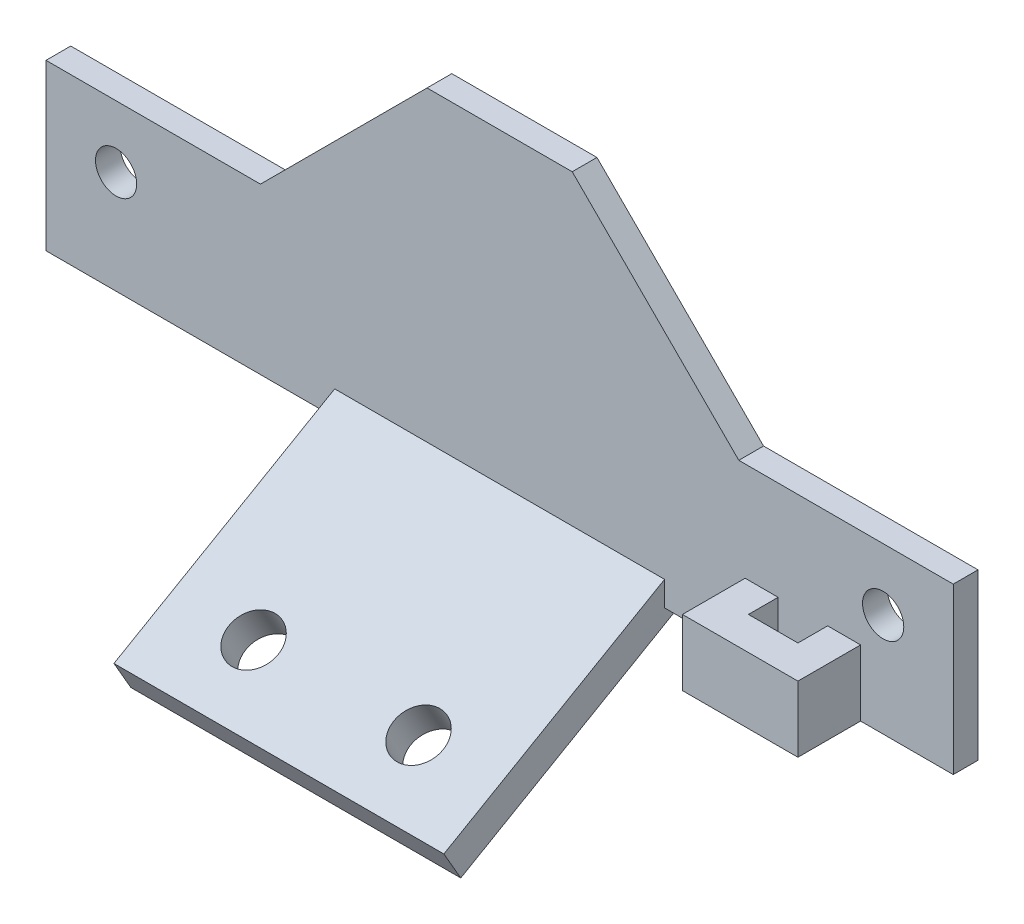
ISO-10303-21;
HEADER;
FILE_DESCRIPTION(('STEP AP214'),'2;1');
FILE_NAME('part.step','',(''),(''),'','','');
FILE_SCHEMA(('AUTOMOTIVE_DESIGN { 1 0 10303 214 1 1 1 1 }'));
ENDSEC;
DATA;
#1=APPLICATION_CONTEXT('core data for automotive mechanical design processes');
#2=APPLICATION_PROTOCOL_DEFINITION('international standard','automotive_design',2000,#1);
#3=PRODUCT_CONTEXT('',#1,'mechanical');
#4=PRODUCT('Part','Part','',(#3));
#5=PRODUCT_RELATED_PRODUCT_CATEGORY('part','',(#4));
#6=PRODUCT_DEFINITION_FORMATION('','',#4);
#7=PRODUCT_DEFINITION_CONTEXT('part definition',#1,'design');
#8=PRODUCT_DEFINITION('design','',#6,#7);
#9=PRODUCT_DEFINITION_SHAPE('','',#8);
#10=(LENGTH_UNIT() NAMED_UNIT(*) SI_UNIT(.MILLI.,.METRE.));
#11=(NAMED_UNIT(*) PLANE_ANGLE_UNIT() SI_UNIT($,.RADIAN.));
#12=(NAMED_UNIT(*) SI_UNIT($,.STERADIAN.) SOLID_ANGLE_UNIT());
#13=UNCERTAINTY_MEASURE_WITH_UNIT(LENGTH_MEASURE(1.E-05),#10,'distance_accuracy_value','');
#14=(GEOMETRIC_REPRESENTATION_CONTEXT(3) GLOBAL_UNCERTAINTY_ASSIGNED_CONTEXT((#13)) GLOBAL_UNIT_ASSIGNED_CONTEXT((#10,
#11,#12)) REPRESENTATION_CONTEXT('',''));
#15=CARTESIAN_POINT('',(0.,0.,0.));
#16=DIRECTION('',(0.,0.,1.));
#17=DIRECTION('',(1.,0.,0.));
#18=AXIS2_PLACEMENT_3D('',#15,#16,#17);
#19=CARTESIAN_POINT('',(0.,0.,1.5));
#20=DIRECTION('',(0.,0.,1.));
#21=DIRECTION('',(1.,0.,0.));
#22=AXIS2_PLACEMENT_3D('',#19,#20,#21);
#23=PLANE('',#22);
#24=DIRECTION('',(0.,-1.,0.));
#25=VECTOR('',#24,1.);
#26=CARTESIAN_POINT('',(-24.4543137079809,8.24999999999999,1.5));
#27=LINE('',#26,#25);
#28=CARTESIAN_POINT('',(-24.4543137079809,8.24999999999999,1.5));
#29=VERTEX_POINT('',#28);
#30=CARTESIAN_POINT('',(-24.4543137079809,4.24999999999999,1.5));
#31=VERTEX_POINT('',#30);
#32=EDGE_CURVE('E237',#29,#31,#27,.T.);
#33=ORIENTED_EDGE('',*,*,#32,.T.);
#34=DIRECTION('',(1.,0.,0.));
#35=VECTOR('',#34,1.);
#36=CARTESIAN_POINT('',(-31.3373101952278,4.24999999999999,1.5));
#37=LINE('',#36,#35);
#38=CARTESIAN_POINT('',(-21.4543137079809,4.24999999999999,1.5));
#39=VERTEX_POINT('',#38);
#40=EDGE_CURVE('E270',#31,#39,#37,.T.);
#41=ORIENTED_EDGE('',*,*,#40,.T.);
#42=DIRECTION('',(0.,-1.,0.));
#43=VECTOR('',#42,1.);
#44=CARTESIAN_POINT('',(-21.4543137079809,8.24999999999999,1.5));
#45=LINE('',#44,#43);
#46=CARTESIAN_POINT('',(-21.4543137079809,8.24999999999999,1.5));
#47=VERTEX_POINT('',#46);
#48=EDGE_CURVE('E230',#47,#39,#45,.T.);
#49=ORIENTED_EDGE('',*,*,#48,.F.);
#50=DIRECTION('',(-1.,0.,0.));
#51=VECTOR('',#50,1.);
#52=CARTESIAN_POINT('',(0.,8.25,1.5));
#53=LINE('',#52,#51);
#54=CARTESIAN_POINT('',(-19.4543137079809,8.24999999999999,1.5));
#55=VERTEX_POINT('',#54);
#56=EDGE_CURVE('E197',#55,#47,#53,.T.);
#57=ORIENTED_EDGE('',*,*,#56,.F.);
#58=DIRECTION('',(0.,-1.,0.));
#59=VECTOR('',#58,1.);
#60=CARTESIAN_POINT('',(-19.4543137079809,8.24999999999999,1.5));
#61=LINE('',#60,#59);
#62=CARTESIAN_POINT('',(-19.4543137079809,4.24999999999999,1.5));
#63=VERTEX_POINT('',#62);
#64=EDGE_CURVE('E201',#55,#63,#61,.T.);
#65=ORIENTED_EDGE('',*,*,#64,.T.);
#66=CARTESIAN_POINT('',(-13.8373101952277,4.24999999999999,1.5));
#67=VERTEX_POINT('',#66);
#68=EDGE_CURVE('E271',#63,#67,#37,.T.);
#69=ORIENTED_EDGE('',*,*,#68,.T.);
#70=DIRECTION('',(0.,1.,0.));
#71=VECTOR('',#70,1.);
#72=CARTESIAN_POINT('',(-13.8373101952278,14.25,1.5));
#73=LINE('',#72,#71);
#74=CARTESIAN_POINT('',(-13.8373101952278,14.25,1.5));
#75=VERTEX_POINT('',#74);
#76=EDGE_CURVE('E312',#67,#75,#73,.T.);
#77=ORIENTED_EDGE('',*,*,#76,.T.);
#78=DIRECTION('',(-1.,0.,0.));
#79=VECTOR('',#78,1.);
#80=CARTESIAN_POINT('',(-13.8373101952278,14.25,1.5));
#81=LINE('',#80,#79);
#82=CARTESIAN_POINT('',(-26.8373101952278,14.25,1.5));
#83=VERTEX_POINT('',#82);
#84=EDGE_CURVE('E315',#75,#83,#81,.T.);
#85=ORIENTED_EDGE('',*,*,#84,.T.);
#86=DIRECTION('',(-0.707106781186557,0.707106781186538,0.));
#87=VECTOR('',#86,1.);
#88=CARTESIAN_POINT('',(-26.8373101952278,14.25,1.5));
#89=LINE('',#88,#87);
#90=CARTESIAN_POINT('',(-36.937310195228,24.35,1.5));
#91=VERTEX_POINT('',#90);
#92=EDGE_CURVE('E317',#83,#91,#89,.T.);
#93=ORIENTED_EDGE('',*,*,#92,.T.);
#94=DIRECTION('',(-1.,0.,0.));
#95=VECTOR('',#94,1.);
#96=CARTESIAN_POINT('',(-36.937310195228,24.35,1.5));
#97=LINE('',#96,#95);
#98=CARTESIAN_POINT('',(-45.7373101952278,24.35,1.5));
#99=VERTEX_POINT('',#98);
#100=EDGE_CURVE('E319',#91,#99,#97,.T.);
#101=ORIENTED_EDGE('',*,*,#100,.T.);
#102=DIRECTION('',(-0.707106781186546,-0.707106781186549,0.));
#103=VECTOR('',#102,1.);
#104=CARTESIAN_POINT('',(-55.8373101952278,14.25,1.5));
#105=LINE('',#104,#103);
#106=CARTESIAN_POINT('',(-55.8373101952278,14.25,1.5));
#107=VERTEX_POINT('',#106);
#108=EDGE_CURVE('E321',#99,#107,#105,.T.);
#109=ORIENTED_EDGE('',*,*,#108,.T.);
#110=DIRECTION('',(-1.,0.,0.));
#111=VECTOR('',#110,1.);
#112=CARTESIAN_POINT('',(-68.8373101952277,14.25,1.5));
#113=LINE('',#112,#111);
#114=CARTESIAN_POINT('',(-68.8373101952277,14.25,1.5));
#115=VERTEX_POINT('',#114);
#116=EDGE_CURVE('E323',#107,#115,#113,.T.);
#117=ORIENTED_EDGE('',*,*,#116,.T.);
#118=DIRECTION('',(0.,-1.,0.));
#119=VECTOR('',#118,1.);
#120=CARTESIAN_POINT('',(-68.8373101952277,14.25,1.5));
#121=LINE('',#120,#119);
#122=CARTESIAN_POINT('',(-68.8373101952277,4.24999999999999,1.5));
#123=VERTEX_POINT('',#122);
#124=EDGE_CURVE('E310',#115,#123,#121,.T.);
#125=ORIENTED_EDGE('',*,*,#124,.T.);
#126=DIRECTION('',(-1.,0.,0.));
#127=VECTOR('',#126,1.);
#128=CARTESIAN_POINT('',(-51.3373101952278,4.24999999999999,1.5));
#129=LINE('',#128,#127);
#130=CARTESIAN_POINT('',(-51.3373101952278,4.24999999999999,1.5));
#131=VERTEX_POINT('',#130);
#132=EDGE_CURVE('E287',#131,#123,#129,.T.);
#133=ORIENTED_EDGE('',*,*,#132,.F.);
#134=DIRECTION('',(0.,-1.,0.));
#135=VECTOR('',#134,1.);
#136=CARTESIAN_POINT('',(-51.3373101952278,4.24999999999999,1.5));
#137=LINE('',#136,#135);
#138=CARTESIAN_POINT('',(-51.3373101952278,5.74999999999999,1.5));
#139=VERTEX_POINT('',#138);
#140=EDGE_CURVE('E284',#139,#131,#137,.T.);
#141=ORIENTED_EDGE('',*,*,#140,.F.);
#142=DIRECTION('',(-1.,0.,0.));
#143=VECTOR('',#142,1.);
#144=CARTESIAN_POINT('',(-13.8373101952277,5.74999999999999,1.5));
#145=LINE('',#144,#143);
#146=CARTESIAN_POINT('',(-31.3373101952278,5.74999999999999,1.5));
#147=VERTEX_POINT('',#146);
#148=EDGE_CURVE('E292',#147,#139,#145,.T.);
#149=ORIENTED_EDGE('',*,*,#148,.F.);
#150=DIRECTION('',(0.,1.,0.));
#151=VECTOR('',#150,1.);
#152=CARTESIAN_POINT('',(-31.3373101952278,5.74999999999999,1.5));
#153=LINE('',#152,#151);
#154=CARTESIAN_POINT('',(-31.3373101952278,4.24999999999999,1.5));
#155=VERTEX_POINT('',#154);
#156=EDGE_CURVE('E253',#155,#147,#153,.T.);
#157=ORIENTED_EDGE('',*,*,#156,.F.);
#158=CARTESIAN_POINT('',(-26.4543137079809,4.24999999999999,1.5));
#159=VERTEX_POINT('',#158);
#160=EDGE_CURVE('E267',#155,#159,#37,.T.);
#161=ORIENTED_EDGE('',*,*,#160,.T.);
#162=DIRECTION('',(0.,-1.,0.));
#163=VECTOR('',#162,1.);
#164=CARTESIAN_POINT('',(-26.4543137079809,8.24999999999999,1.5));
#165=LINE('',#164,#163);
#166=CARTESIAN_POINT('',(-26.4543137079809,8.24999999999999,1.5));
#167=VERTEX_POINT('',#166);
#168=EDGE_CURVE('E53',#167,#159,#165,.T.);
#169=ORIENTED_EDGE('',*,*,#168,.F.);
#170=EDGE_CURVE('E48',#29,#167,#53,.T.);
#171=ORIENTED_EDGE('',*,*,#170,.F.);
#172=EDGE_LOOP('',(#33,#41,#49,#57,#65,#69,#77,#85,#93,#101,#109,#117,#125,#133,#141,#149,#157,
#161,#169,#171));
#173=FACE_BOUND('',#172,.T.);
#174=CARTESIAN_POINT('',(-18.0873101952277,10.5,1.5));
#175=DIRECTION('',(0.,0.,1.));
#176=DIRECTION('',(1.,0.,0.));
#177=AXIS2_PLACEMENT_3D('',#174,#175,#176);
#178=CIRCLE('',#177,1.25);
#179=CARTESIAN_POINT('',(-16.8373101952277,10.5,1.5));
#180=VERTEX_POINT('',#179);
#181=EDGE_CURVE('E304',#180,#180,#178,.T.);
#182=ORIENTED_EDGE('',*,*,#181,.F.);
#183=EDGE_LOOP('',(#182));
#184=FACE_BOUND('',#183,.T.);
#185=CARTESIAN_POINT('',(-64.5873101952277,10.5,1.5));
#186=DIRECTION('',(0.,0.,1.));
#187=DIRECTION('',(1.,0.,0.));
#188=AXIS2_PLACEMENT_3D('',#185,#186,#187);
#189=CIRCLE('',#188,1.25);
#190=CARTESIAN_POINT('',(-63.3373101952277,10.5,1.5));
#191=VERTEX_POINT('',#190);
#192=EDGE_CURVE('E298',#191,#191,#189,.T.);
#193=ORIENTED_EDGE('',*,*,#192,.F.);
#194=EDGE_LOOP('',(#193));
#195=FACE_BOUND('',#194,.T.);
#196=ADVANCED_FACE('F33',(#173,#184,#195),#23,.T.);
#197=CARTESIAN_POINT('',(-13.8373101952277,5.74999999999999,1.5));
#198=DIRECTION('',(0.,0.86602540378444,0.499999999999997));
#199=DIRECTION('',(0.,-0.499999999999998,0.86602540378444));
#200=AXIS2_PLACEMENT_3D('',#197,#198,#199);
#201=PLANE('',#200);
#202=CARTESIAN_POINT('',(-36.3373101952278,0.0245190528383528,11.4168238982516));
#203=DIRECTION('',(0.,-0.86602540378444,-0.499999999999998));
#204=DIRECTION('',(0.,0.499999999999998,-0.86602540378444));
#205=AXIS2_PLACEMENT_3D('',#202,#203,#204);
#206=CIRCLE('',#205,1.5);
#207=CARTESIAN_POINT('',(-36.3373101952278,0.774519052838351,10.1177857925749));
#208=VERTEX_POINT('',#207);
#209=EDGE_CURVE('E241',#208,#208,#206,.T.);
#210=ORIENTED_EDGE('',*,*,#209,.T.);
#211=EDGE_LOOP('',(#210));
#212=FACE_BOUND('',#211,.T.);
#213=CARTESIAN_POINT('',(-46.3373101952278,0.0245190528383537,11.4168238982516));
#214=DIRECTION('',(0.,-0.86602540378444,-0.499999999999998));
#215=DIRECTION('',(0.,0.499999999999998,-0.86602540378444));
#216=AXIS2_PLACEMENT_3D('',#213,#214,#215);
#217=CIRCLE('',#216,1.5);
#218=CARTESIAN_POINT('',(-46.3373101952278,0.774519052838352,10.1177857925749));
#219=VERTEX_POINT('',#218);
#220=EDGE_CURVE('E248',#219,#219,#217,.T.);
#221=ORIENTED_EDGE('',*,*,#220,.T.);
#222=EDGE_LOOP('',(#221));
#223=FACE_BOUND('',#222,.T.);
#224=DIRECTION('',(-1.,0.,0.));
#225=VECTOR('',#224,1.);
#226=CARTESIAN_POINT('',(-13.8373101952277,-1.97548094716164,14.8809255133894));
#227=LINE('',#226,#225);
#228=CARTESIAN_POINT('',(-31.3373101952278,-1.97548094716164,14.8809255133894));
#229=VERTEX_POINT('',#228);
#230=CARTESIAN_POINT('',(-51.3373101952278,-1.97548094716164,14.8809255133894));
#231=VERTEX_POINT('',#230);
#232=EDGE_CURVE('E295',#229,#231,#227,.T.);
#233=ORIENTED_EDGE('',*,*,#232,.F.);
#234=DIRECTION('',(0.,-0.499999999999998,0.86602540378444));
#235=VECTOR('',#234,1.);
#236=CARTESIAN_POINT('',(-31.3373101952278,5.74999999999999,1.5));
#237=LINE('',#236,#235);
#238=EDGE_CURVE('E255',#147,#229,#237,.T.);
#239=ORIENTED_EDGE('',*,*,#238,.F.);
#240=ORIENTED_EDGE('',*,*,#148,.T.);
#241=DIRECTION('',(0.,0.499999999999998,-0.86602540378444));
#242=VECTOR('',#241,1.);
#243=CARTESIAN_POINT('',(-51.3373101952278,5.74999999999999,1.5));
#244=LINE('',#243,#242);
#245=EDGE_CURVE('E281',#231,#139,#244,.T.);
#246=ORIENTED_EDGE('',*,*,#245,.F.);
#247=EDGE_LOOP('',(#233,#239,#240,#246));
#248=FACE_BOUND('',#247,.T.);
#249=ADVANCED_FACE('F410',(#212,#223,#248),#201,.T.);
#250=CARTESIAN_POINT('',(-13.8373101952277,-3.74999999999997,13.856406460551));
#251=DIRECTION('',(0.,-0.499999999999998,0.86602540378444));
#252=DIRECTION('',(0.,-0.86602540378444,-0.499999999999998));
#253=AXIS2_PLACEMENT_3D('',#250,#251,#252);
#254=PLANE('',#253);
#255=DIRECTION('',(-1.,0.,0.));
#256=VECTOR('',#255,1.);
#257=CARTESIAN_POINT('',(-13.8373101952277,-3.74999999999997,13.856406460551));
#258=LINE('',#257,#256);
#259=CARTESIAN_POINT('',(-31.3373101952278,-3.74999999999997,13.856406460551));
#260=VERTEX_POINT('',#259);
#261=CARTESIAN_POINT('',(-51.3373101952278,-3.74999999999997,13.856406460551));
#262=VERTEX_POINT('',#261);
#263=EDGE_CURVE('E291',#260,#262,#258,.T.);
#264=ORIENTED_EDGE('',*,*,#263,.F.);
#265=DIRECTION('',(0.,-0.86602540378444,-0.499999999999998));
#266=VECTOR('',#265,1.);
#267=CARTESIAN_POINT('',(-31.3373101952278,-1.97548094716164,14.8809255133894));
#268=LINE('',#267,#266);
#269=EDGE_CURVE('E257',#229,#260,#268,.T.);
#270=ORIENTED_EDGE('',*,*,#269,.F.);
#271=ORIENTED_EDGE('',*,*,#232,.T.);
#272=DIRECTION('',(0.,0.86602540378444,0.499999999999998));
#273=VECTOR('',#272,1.);
#274=CARTESIAN_POINT('',(-51.3373101952278,-3.74999999999997,13.856406460551));
#275=LINE('',#274,#273);
#276=EDGE_CURVE('E278',#262,#231,#275,.T.);
#277=ORIENTED_EDGE('',*,*,#276,.F.);
#278=EDGE_LOOP('',(#264,#270,#271,#277));
#279=FACE_BOUND('',#278,.T.);
#280=ADVANCED_FACE('F405',(#279),#254,.T.);
#281=CARTESIAN_POINT('',(-13.8373101952277,4.24999999999999,0.));
#282=DIRECTION('',(0.,-0.86602540378444,-0.499999999999998));
#283=DIRECTION('',(0.,0.499999999999998,-0.86602540378444));
#284=AXIS2_PLACEMENT_3D('',#281,#282,#283);
#285=PLANE('',#284);
#286=CARTESIAN_POINT('',(-36.3373101952278,-1.74999999999998,10.3923048454133));
#287=DIRECTION('',(0.,-0.86602540378444,-0.499999999999998));
#288=DIRECTION('',(0.,0.499999999999998,-0.86602540378444));
#289=AXIS2_PLACEMENT_3D('',#286,#287,#288);
#290=CIRCLE('',#289,1.5);
#291=CARTESIAN_POINT('',(-36.3373101952278,-0.999999999999979,9.09326673973661));
#292=VERTEX_POINT('',#291);
#293=EDGE_CURVE('E245',#292,#292,#290,.T.);
#294=ORIENTED_EDGE('',*,*,#293,.F.);
#295=EDGE_LOOP('',(#294));
#296=FACE_BOUND('',#295,.T.);
#297=CARTESIAN_POINT('',(-46.3373101952278,-1.74999999999998,10.3923048454133));
#298=DIRECTION('',(0.,-0.86602540378444,-0.499999999999998));
#299=DIRECTION('',(0.,0.499999999999998,-0.86602540378444));
#300=AXIS2_PLACEMENT_3D('',#297,#298,#299);
#301=CIRCLE('',#300,1.5);
#302=CARTESIAN_POINT('',(-46.3373101952278,-0.999999999999978,9.09326673973661));
#303=VERTEX_POINT('',#302);
#304=EDGE_CURVE('E229',#303,#303,#301,.T.);
#305=ORIENTED_EDGE('',*,*,#304,.F.);
#306=EDGE_LOOP('',(#305));
#307=FACE_BOUND('',#306,.T.);
#308=DIRECTION('',(1.,0.,0.));
#309=VECTOR('',#308,1.);
#310=CARTESIAN_POINT('',(-68.8373101952277,4.24999999999999,0.));
#311=LINE('',#310,#309);
#312=CARTESIAN_POINT('',(-51.3373101952278,4.24999999999999,0.));
#313=VERTEX_POINT('',#312);
#314=CARTESIAN_POINT('',(-31.3373101952278,4.24999999999999,0.));
#315=VERTEX_POINT('',#314);
#316=EDGE_CURVE('E328',#313,#315,#311,.T.);
#317=ORIENTED_EDGE('',*,*,#316,.T.);
#318=DIRECTION('',(0.,0.499999999999998,-0.86602540378444));
#319=VECTOR('',#318,1.);
#320=CARTESIAN_POINT('',(-31.3373101952277,-3.74999999999997,13.856406460551));
#321=LINE('',#320,#319);
#322=EDGE_CURVE('E259',#260,#315,#321,.T.);
#323=ORIENTED_EDGE('',*,*,#322,.F.);
#324=ORIENTED_EDGE('',*,*,#263,.T.);
#325=DIRECTION('',(0.,-0.499999999999998,0.86602540378444));
#326=VECTOR('',#325,1.);
#327=CARTESIAN_POINT('',(-51.3373101952278,4.24999999999999,0.));
#328=LINE('',#327,#326);
#329=EDGE_CURVE('E275',#313,#262,#328,.T.);
#330=ORIENTED_EDGE('',*,*,#329,.F.);
#331=EDGE_LOOP('',(#317,#323,#324,#330));
#332=FACE_BOUND('',#331,.T.);
#333=ADVANCED_FACE('F397',(#296,#307,#332),#285,.T.);
#334=CARTESIAN_POINT('',(0.,0.,0.));
#335=DIRECTION('',(0.,0.,1.));
#336=DIRECTION('',(1.,0.,0.));
#337=AXIS2_PLACEMENT_3D('',#334,#335,#336);
#338=PLANE('',#337);
#339=DIRECTION('',(0.,-1.,0.));
#340=VECTOR('',#339,1.);
#341=CARTESIAN_POINT('',(-68.8373101952277,14.25,0.));
#342=LINE('',#341,#340);
#343=CARTESIAN_POINT('',(-68.8373101952277,14.25,0.));
#344=VERTEX_POINT('',#343);
#345=CARTESIAN_POINT('',(-68.8373101952277,4.24999999999999,0.));
#346=VERTEX_POINT('',#345);
#347=EDGE_CURVE('E307',#344,#346,#342,.T.);
#348=ORIENTED_EDGE('',*,*,#347,.F.);
#349=DIRECTION('',(-1.,0.,0.));
#350=VECTOR('',#349,1.);
#351=CARTESIAN_POINT('',(-68.8373101952277,14.25,0.));
#352=LINE('',#351,#350);
#353=CARTESIAN_POINT('',(-55.8373101952278,14.25,0.));
#354=VERTEX_POINT('',#353);
#355=EDGE_CURVE('E313',#354,#344,#352,.T.);
#356=ORIENTED_EDGE('',*,*,#355,.F.);
#357=DIRECTION('',(-0.707106781186546,-0.707106781186549,0.));
#358=VECTOR('',#357,1.);
#359=CARTESIAN_POINT('',(-55.8373101952278,14.25,0.));
#360=LINE('',#359,#358);
#361=CARTESIAN_POINT('',(-45.7373101952278,24.35,0.));
#362=VERTEX_POINT('',#361);
#363=EDGE_CURVE('E340',#362,#354,#360,.T.);
#364=ORIENTED_EDGE('',*,*,#363,.F.);
#365=DIRECTION('',(-1.,0.,0.));
#366=VECTOR('',#365,1.);
#367=CARTESIAN_POINT('',(-36.937310195228,24.35,0.));
#368=LINE('',#367,#366);
#369=CARTESIAN_POINT('',(-36.937310195228,24.35,0.));
#370=VERTEX_POINT('',#369);
#371=EDGE_CURVE('E338',#370,#362,#368,.T.);
#372=ORIENTED_EDGE('',*,*,#371,.F.);
#373=DIRECTION('',(-0.707106781186557,0.707106781186538,0.));
#374=VECTOR('',#373,1.);
#375=CARTESIAN_POINT('',(-26.8373101952278,14.25,0.));
#376=LINE('',#375,#374);
#377=CARTESIAN_POINT('',(-26.8373101952278,14.25,0.));
#378=VERTEX_POINT('',#377);
#379=EDGE_CURVE('E336',#378,#370,#376,.T.);
#380=ORIENTED_EDGE('',*,*,#379,.F.);
#381=DIRECTION('',(-1.,0.,0.));
#382=VECTOR('',#381,1.);
#383=CARTESIAN_POINT('',(-13.8373101952278,14.25,0.));
#384=LINE('',#383,#382);
#385=CARTESIAN_POINT('',(-13.8373101952278,14.25,0.));
#386=VERTEX_POINT('',#385);
#387=EDGE_CURVE('E334',#386,#378,#384,.T.);
#388=ORIENTED_EDGE('',*,*,#387,.F.);
#389=DIRECTION('',(0.,1.,0.));
#390=VECTOR('',#389,1.);
#391=CARTESIAN_POINT('',(-13.8373101952278,14.25,0.));
#392=LINE('',#391,#390);
#393=CARTESIAN_POINT('',(-13.8373101952277,4.24999999999999,0.));
#394=VERTEX_POINT('',#393);
#395=EDGE_CURVE('E332',#394,#386,#392,.T.);
#396=ORIENTED_EDGE('',*,*,#395,.F.);
#397=DIRECTION('',(1.,0.,0.));
#398=VECTOR('',#397,1.);
#399=CARTESIAN_POINT('',(-31.3373101952278,4.24999999999999,0.));
#400=LINE('',#399,#398);
#401=EDGE_CURVE('E264',#315,#394,#400,.T.);
#402=ORIENTED_EDGE('',*,*,#401,.F.);
#403=ORIENTED_EDGE('',*,*,#316,.F.);
#404=EDGE_CURVE('E329',#346,#313,#311,.T.);
#405=ORIENTED_EDGE('',*,*,#404,.F.);
#406=EDGE_LOOP('',(#348,#356,#364,#372,#380,#388,#396,#402,#403,#405));
#407=FACE_BOUND('',#406,.T.);
#408=CARTESIAN_POINT('',(-18.0873101952277,10.5,0.));
#409=DIRECTION('',(0.,0.,1.));
#410=DIRECTION('',(1.,0.,0.));
#411=AXIS2_PLACEMENT_3D('',#408,#409,#410);
#412=CIRCLE('',#411,1.25);
#413=CARTESIAN_POINT('',(-16.8373101952277,10.5,0.));
#414=VERTEX_POINT('',#413);
#415=EDGE_CURVE('E301',#414,#414,#412,.T.);
#416=ORIENTED_EDGE('',*,*,#415,.T.);
#417=EDGE_LOOP('',(#416));
#418=FACE_BOUND('',#417,.T.);
#419=CARTESIAN_POINT('',(-64.5873101952277,10.5,0.));
#420=DIRECTION('',(0.,0.,1.));
#421=DIRECTION('',(1.,0.,0.));
#422=AXIS2_PLACEMENT_3D('',#419,#420,#421);
#423=CIRCLE('',#422,1.25);
#424=CARTESIAN_POINT('',(-63.3373101952277,10.5,0.));
#425=VERTEX_POINT('',#424);
#426=EDGE_CURVE('E294',#425,#425,#423,.T.);
#427=ORIENTED_EDGE('',*,*,#426,.T.);
#428=EDGE_LOOP('',(#427));
#429=FACE_BOUND('',#428,.T.);
#430=ADVANCED_FACE('F366',(#407,#418,#429),#338,.F.);
#431=CARTESIAN_POINT('',(-68.8373101952277,14.25,1.5));
#432=DIRECTION('',(1.,0.,0.));
#433=DIRECTION('',(0.,0.,-1.));
#434=AXIS2_PLACEMENT_3D('',#431,#432,#433);
#435=PLANE('',#434);
#436=ORIENTED_EDGE('',*,*,#347,.T.);
#437=DIRECTION('',(0.,0.,-1.));
#438=VECTOR('',#437,1.);
#439=CARTESIAN_POINT('',(-68.8373101952277,4.24999999999999,1.5));
#440=LINE('',#439,#438);
#441=EDGE_CURVE('E269',#123,#346,#440,.T.);
#442=ORIENTED_EDGE('',*,*,#441,.F.);
#443=ORIENTED_EDGE('',*,*,#124,.F.);
#444=DIRECTION('',(0.,0.,-1.));
#445=VECTOR('',#444,1.);
#446=CARTESIAN_POINT('',(-68.8373101952277,14.25,1.5));
#447=LINE('',#446,#445);
#448=EDGE_CURVE('E325',#115,#344,#447,.T.);
#449=ORIENTED_EDGE('',*,*,#448,.T.);
#450=EDGE_LOOP('',(#436,#442,#443,#449));
#451=FACE_BOUND('',#450,.T.);
#452=ADVANCED_FACE('F35',(#451),#435,.F.);
#453=CARTESIAN_POINT('',(-13.8373101952278,14.25,1.5));
#454=DIRECTION('',(-1.,0.,0.));
#455=DIRECTION('',(0.,-1.,0.));
#456=AXIS2_PLACEMENT_3D('',#453,#454,#455);
#457=PLANE('',#456);
#458=ORIENTED_EDGE('',*,*,#76,.F.);
#459=DIRECTION('',(0.,0.,1.));
#460=VECTOR('',#459,1.);
#461=CARTESIAN_POINT('',(-13.8373101952277,4.24999999999999,1.5));
#462=LINE('',#461,#460);
#463=EDGE_CURVE('E244',#394,#67,#462,.T.);
#464=ORIENTED_EDGE('',*,*,#463,.F.);
#465=ORIENTED_EDGE('',*,*,#395,.T.);
#466=DIRECTION('',(0.,0.,-1.));
#467=VECTOR('',#466,1.);
#468=CARTESIAN_POINT('',(-13.8373101952278,14.25,1.5));
#469=LINE('',#468,#467);
#470=EDGE_CURVE('E11',#75,#386,#469,.T.);
#471=ORIENTED_EDGE('',*,*,#470,.F.);
#472=EDGE_LOOP('',(#458,#464,#465,#471));
#473=FACE_BOUND('',#472,.T.);
#474=ADVANCED_FACE('F386',(#473),#457,.F.);
#475=CARTESIAN_POINT('',(-13.8373101952278,14.25,1.5));
#476=DIRECTION('',(0.,-1.,0.));
#477=DIRECTION('',(0.,0.,-1.));
#478=AXIS2_PLACEMENT_3D('',#475,#476,#477);
#479=PLANE('',#478);
#480=ORIENTED_EDGE('',*,*,#387,.T.);
#481=DIRECTION('',(0.,0.,-1.));
#482=VECTOR('',#481,1.);
#483=CARTESIAN_POINT('',(-26.8373101952278,14.25,1.5));
#484=LINE('',#483,#482);
#485=EDGE_CURVE('E41',#83,#378,#484,.T.);
#486=ORIENTED_EDGE('',*,*,#485,.F.);
#487=ORIENTED_EDGE('',*,*,#84,.F.);
#488=ORIENTED_EDGE('',*,*,#470,.T.);
#489=EDGE_LOOP('',(#480,#486,#487,#488));
#490=FACE_BOUND('',#489,.T.);
#491=ADVANCED_FACE('F384',(#490),#479,.F.);
#492=CARTESIAN_POINT('',(-26.8373101952278,14.25,1.5));
#493=DIRECTION('',(-0.707106781186538,-0.707106781186557,0.));
#494=DIRECTION('',(0.707106781186557,-0.707106781186538,0.));
#495=AXIS2_PLACEMENT_3D('',#492,#493,#494);
#496=PLANE('',#495);
#497=ORIENTED_EDGE('',*,*,#379,.T.);
#498=DIRECTION('',(0.,0.,-1.));
#499=VECTOR('',#498,1.);
#500=CARTESIAN_POINT('',(-36.937310195228,24.35,1.5));
#501=LINE('',#500,#499);
#502=EDGE_CURVE('E351',#91,#370,#501,.T.);
#503=ORIENTED_EDGE('',*,*,#502,.F.);
#504=ORIENTED_EDGE('',*,*,#92,.F.);
#505=ORIENTED_EDGE('',*,*,#485,.T.);
#506=EDGE_LOOP('',(#497,#503,#504,#505));
#507=FACE_BOUND('',#506,.T.);
#508=ADVANCED_FACE('F358',(#507),#496,.F.);
#509=CARTESIAN_POINT('',(-36.937310195228,24.35,1.5));
#510=DIRECTION('',(0.,-1.,0.));
#511=DIRECTION('',(0.,0.,-1.));
#512=AXIS2_PLACEMENT_3D('',#509,#510,#511);
#513=PLANE('',#512);
#514=ORIENTED_EDGE('',*,*,#371,.T.);
#515=DIRECTION('',(0.,0.,-1.));
#516=VECTOR('',#515,1.);
#517=CARTESIAN_POINT('',(-45.7373101952278,24.35,1.5));
#518=LINE('',#517,#516);
#519=EDGE_CURVE('E348',#99,#362,#518,.T.);
#520=ORIENTED_EDGE('',*,*,#519,.F.);
#521=ORIENTED_EDGE('',*,*,#100,.F.);
#522=ORIENTED_EDGE('',*,*,#502,.T.);
#523=EDGE_LOOP('',(#514,#520,#521,#522));
#524=FACE_BOUND('',#523,.T.);
#525=ADVANCED_FACE('F373',(#524),#513,.F.);
#526=CARTESIAN_POINT('',(-55.8373101952278,14.25,1.5));
#527=DIRECTION('',(0.707106781186549,-0.707106781186546,0.));
#528=DIRECTION('',(0.707106781186546,0.707106781186549,0.));
#529=AXIS2_PLACEMENT_3D('',#526,#527,#528);
#530=PLANE('',#529);
#531=ORIENTED_EDGE('',*,*,#363,.T.);
#532=DIRECTION('',(0.,0.,-1.));
#533=VECTOR('',#532,1.);
#534=CARTESIAN_POINT('',(-55.8373101952278,14.25,1.5));
#535=LINE('',#534,#533);
#536=EDGE_CURVE('E345',#107,#354,#535,.T.);
#537=ORIENTED_EDGE('',*,*,#536,.F.);
#538=ORIENTED_EDGE('',*,*,#108,.F.);
#539=ORIENTED_EDGE('',*,*,#519,.T.);
#540=EDGE_LOOP('',(#531,#537,#538,#539));
#541=FACE_BOUND('',#540,.T.);
#542=ADVANCED_FACE('F377',(#541),#530,.F.);
#543=CARTESIAN_POINT('',(-68.8373101952277,14.25,1.5));
#544=DIRECTION('',(0.,-1.,0.));
#545=DIRECTION('',(0.,0.,-1.));
#546=AXIS2_PLACEMENT_3D('',#543,#544,#545);
#547=PLANE('',#546);
#548=ORIENTED_EDGE('',*,*,#355,.T.);
#549=ORIENTED_EDGE('',*,*,#448,.F.);
#550=ORIENTED_EDGE('',*,*,#116,.F.);
#551=ORIENTED_EDGE('',*,*,#536,.T.);
#552=EDGE_LOOP('',(#548,#549,#550,#551));
#553=FACE_BOUND('',#552,.T.);
#554=ADVANCED_FACE('F420',(#553),#547,.F.);
#555=CARTESIAN_POINT('',(-18.0873101952277,10.5,1.5));
#556=DIRECTION('',(0.,0.,-1.));
#557=DIRECTION('',(-1.,0.,0.));
#558=AXIS2_PLACEMENT_3D('',#555,#556,#557);
#559=CYLINDRICAL_SURFACE('',#558,1.25);
#560=ORIENTED_EDGE('',*,*,#181,.T.);
#561=EDGE_LOOP('',(#560));
#562=FACE_BOUND('',#561,.T.);
#563=ORIENTED_EDGE('',*,*,#415,.F.);
#564=EDGE_LOOP('',(#563));
#565=FACE_BOUND('',#564,.T.);
#566=ADVANCED_FACE('F422',(#562,#565),#559,.F.);
#567=CARTESIAN_POINT('',(-64.5873101952277,10.5,1.5));
#568=DIRECTION('',(0.,0.,-1.));
#569=DIRECTION('',(-1.,0.,0.));
#570=AXIS2_PLACEMENT_3D('',#567,#568,#569);
#571=CYLINDRICAL_SURFACE('',#570,1.25);
#572=ORIENTED_EDGE('',*,*,#192,.T.);
#573=EDGE_LOOP('',(#572));
#574=FACE_BOUND('',#573,.T.);
#575=ORIENTED_EDGE('',*,*,#426,.F.);
#576=EDGE_LOOP('',(#575));
#577=FACE_BOUND('',#576,.T.);
#578=ADVANCED_FACE('F428',(#574,#577),#571,.F.);
#579=CARTESIAN_POINT('',(-51.3373101952278,4.24999999999999,1.5));
#580=DIRECTION('',(0.,1.,0.));
#581=DIRECTION('',(0.,0.,1.));
#582=AXIS2_PLACEMENT_3D('',#579,#580,#581);
#583=PLANE('',#582);
#584=ORIENTED_EDGE('',*,*,#441,.T.);
#585=ORIENTED_EDGE('',*,*,#404,.T.);
#586=DIRECTION('',(0.,0.,-1.));
#587=VECTOR('',#586,1.);
#588=CARTESIAN_POINT('',(-51.3373101952278,4.24999999999999,1.5));
#589=LINE('',#588,#587);
#590=EDGE_CURVE('E273',#131,#313,#589,.T.);
#591=ORIENTED_EDGE('',*,*,#590,.F.);
#592=ORIENTED_EDGE('',*,*,#132,.T.);
#593=EDGE_LOOP('',(#584,#585,#591,#592));
#594=FACE_BOUND('',#593,.T.);
#595=ADVANCED_FACE('F417',(#594),#583,.F.);
#596=CARTESIAN_POINT('',(-51.3373101952278,0.,0.));
#597=DIRECTION('',(1.,0.,0.));
#598=DIRECTION('',(0.,0.,-1.));
#599=AXIS2_PLACEMENT_3D('',#596,#597,#598);
#600=PLANE('',#599);
#601=ORIENTED_EDGE('',*,*,#590,.T.);
#602=ORIENTED_EDGE('',*,*,#329,.T.);
#603=ORIENTED_EDGE('',*,*,#276,.T.);
#604=ORIENTED_EDGE('',*,*,#245,.T.);
#605=ORIENTED_EDGE('',*,*,#140,.T.);
#606=EDGE_LOOP('',(#601,#602,#603,#604,#605));
#607=FACE_BOUND('',#606,.T.);
#608=ADVANCED_FACE('F401',(#607),#600,.F.);
#609=CARTESIAN_POINT('',(-31.3373101952278,4.24999999999999,1.5));
#610=DIRECTION('',(0.,1.,0.));
#611=DIRECTION('',(-1.,0.,0.));
#612=AXIS2_PLACEMENT_3D('',#609,#610,#611);
#613=PLANE('',#612);
#614=DIRECTION('',(0.,0.,1.));
#615=VECTOR('',#614,1.);
#616=CARTESIAN_POINT('',(-21.4543137079809,4.24999999999999,0.));
#617=LINE('',#616,#615);
#618=CARTESIAN_POINT('',(-21.4543137079809,4.24999999999999,3.3));
#619=VERTEX_POINT('',#618);
#620=EDGE_CURVE('E202',#39,#619,#617,.T.);
#621=ORIENTED_EDGE('',*,*,#620,.F.);
#622=ORIENTED_EDGE('',*,*,#40,.F.);
#623=DIRECTION('',(0.,0.,1.));
#624=VECTOR('',#623,1.);
#625=CARTESIAN_POINT('',(-24.4543137079809,4.24999999999999,0.));
#626=LINE('',#625,#624);
#627=CARTESIAN_POINT('',(-24.4543137079809,4.24999999999999,3.3));
#628=VERTEX_POINT('',#627);
#629=EDGE_CURVE('E223',#31,#628,#626,.T.);
#630=ORIENTED_EDGE('',*,*,#629,.T.);
#631=DIRECTION('',(1.,0.,0.));
#632=VECTOR('',#631,1.);
#633=CARTESIAN_POINT('',(0.,4.25,3.3));
#634=LINE('',#633,#632);
#635=EDGE_CURVE('E205',#628,#619,#634,.T.);
#636=ORIENTED_EDGE('',*,*,#635,.T.);
#637=EDGE_LOOP('',(#621,#622,#630,#636));
#638=FACE_BOUND('',#637,.T.);
#639=ORIENTED_EDGE('',*,*,#463,.T.);
#640=ORIENTED_EDGE('',*,*,#68,.F.);
#641=DIRECTION('',(0.,0.,-1.));
#642=VECTOR('',#641,1.);
#643=CARTESIAN_POINT('',(-19.4543137079809,4.24999999999999,0.));
#644=LINE('',#643,#642);
#645=CARTESIAN_POINT('',(-19.4543137079809,4.24999999999999,5.3));
#646=VERTEX_POINT('',#645);
#647=EDGE_CURVE('E218',#646,#63,#644,.T.);
#648=ORIENTED_EDGE('',*,*,#647,.F.);
#649=DIRECTION('',(1.,0.,0.));
#650=VECTOR('',#649,1.);
#651=CARTESIAN_POINT('',(0.,4.25,5.3));
#652=LINE('',#651,#650);
#653=CARTESIAN_POINT('',(-26.4543137079809,4.24999999999999,5.3));
#654=VERTEX_POINT('',#653);
#655=EDGE_CURVE('E192',#654,#646,#652,.T.);
#656=ORIENTED_EDGE('',*,*,#655,.F.);
#657=DIRECTION('',(0.,0.,1.));
#658=VECTOR('',#657,1.);
#659=CARTESIAN_POINT('',(-26.4543137079809,4.24999999999999,0.));
#660=LINE('',#659,#658);
#661=EDGE_CURVE('E221',#159,#654,#660,.T.);
#662=ORIENTED_EDGE('',*,*,#661,.F.);
#663=ORIENTED_EDGE('',*,*,#160,.F.);
#664=DIRECTION('',(0.,0.,1.));
#665=VECTOR('',#664,1.);
#666=CARTESIAN_POINT('',(-31.3373101952278,4.24999999999999,1.5));
#667=LINE('',#666,#665);
#668=EDGE_CURVE('E261',#315,#155,#667,.T.);
#669=ORIENTED_EDGE('',*,*,#668,.F.);
#670=ORIENTED_EDGE('',*,*,#401,.T.);
#671=EDGE_LOOP('',(#639,#640,#648,#656,#662,#663,#669,#670));
#672=FACE_BOUND('',#671,.T.);
#673=ADVANCED_FACE('F470',(#638,#672),#613,.F.);
#674=CARTESIAN_POINT('',(-31.3373101952278,0.,0.));
#675=DIRECTION('',(1.,0.,0.));
#676=DIRECTION('',(0.,0.,-1.));
#677=AXIS2_PLACEMENT_3D('',#674,#675,#676);
#678=PLANE('',#677);
#679=ORIENTED_EDGE('',*,*,#156,.T.);
#680=ORIENTED_EDGE('',*,*,#238,.T.);
#681=ORIENTED_EDGE('',*,*,#269,.T.);
#682=ORIENTED_EDGE('',*,*,#322,.T.);
#683=ORIENTED_EDGE('',*,*,#668,.T.);
#684=EDGE_LOOP('',(#679,#680,#681,#682,#683));
#685=FACE_BOUND('',#684,.T.);
#686=ADVANCED_FACE('F475',(#685),#678,.T.);
#687=CARTESIAN_POINT('',(-46.3373101952278,0.0245190528383537,11.4168238982516));
#688=DIRECTION('',(0.,-0.86602540378444,-0.499999999999998));
#689=DIRECTION('',(0.,0.499999999999998,-0.86602540378444));
#690=AXIS2_PLACEMENT_3D('',#687,#688,#689);
#691=CYLINDRICAL_SURFACE('',#690,1.5);
#692=ORIENTED_EDGE('',*,*,#220,.F.);
#693=EDGE_LOOP('',(#692));
#694=FACE_BOUND('',#693,.T.);
#695=ORIENTED_EDGE('',*,*,#304,.T.);
#696=EDGE_LOOP('',(#695));
#697=FACE_BOUND('',#696,.T.);
#698=ADVANCED_FACE('F479',(#694,#697),#691,.F.);
#699=CARTESIAN_POINT('',(-36.3373101952278,0.0245190528383528,11.4168238982516));
#700=DIRECTION('',(0.,-0.86602540378444,-0.499999999999998));
#701=DIRECTION('',(0.,0.499999999999998,-0.86602540378444));
#702=AXIS2_PLACEMENT_3D('',#699,#700,#701);
#703=CYLINDRICAL_SURFACE('',#702,1.5);
#704=ORIENTED_EDGE('',*,*,#209,.F.);
#705=EDGE_LOOP('',(#704));
#706=FACE_BOUND('',#705,.T.);
#707=ORIENTED_EDGE('',*,*,#293,.T.);
#708=EDGE_LOOP('',(#707));
#709=FACE_BOUND('',#708,.T.);
#710=ADVANCED_FACE('F483',(#706,#709),#703,.F.);
#711=CARTESIAN_POINT('',(-19.4543137079809,8.24999999999999,0.));
#712=DIRECTION('',(-1.,0.,0.));
#713=DIRECTION('',(0.,-1.,0.));
#714=AXIS2_PLACEMENT_3D('',#711,#712,#713);
#715=PLANE('',#714);
#716=ORIENTED_EDGE('',*,*,#647,.T.);
#717=ORIENTED_EDGE('',*,*,#64,.F.);
#718=DIRECTION('',(0.,0.,-1.));
#719=VECTOR('',#718,1.);
#720=CARTESIAN_POINT('',(-19.4543137079809,8.24999999999999,0.));
#721=LINE('',#720,#719);
#722=CARTESIAN_POINT('',(-19.4543137079809,8.24999999999999,5.3));
#723=VERTEX_POINT('',#722);
#724=EDGE_CURVE('E180',#723,#55,#721,.T.);
#725=ORIENTED_EDGE('',*,*,#724,.F.);
#726=DIRECTION('',(0.,-1.,0.));
#727=VECTOR('',#726,1.);
#728=CARTESIAN_POINT('',(-19.4543137079809,8.24999999999999,5.3));
#729=LINE('',#728,#727);
#730=EDGE_CURVE('E189',#723,#646,#729,.T.);
#731=ORIENTED_EDGE('',*,*,#730,.T.);
#732=EDGE_LOOP('',(#716,#717,#725,#731));
#733=FACE_BOUND('',#732,.T.);
#734=ADVANCED_FACE('F199',(#733),#715,.F.);
#735=CARTESIAN_POINT('',(-21.4543137079809,8.24999999999999,0.));
#736=DIRECTION('',(1.,0.,0.));
#737=DIRECTION('',(0.,1.,0.));
#738=AXIS2_PLACEMENT_3D('',#735,#736,#737);
#739=PLANE('',#738);
#740=ORIENTED_EDGE('',*,*,#620,.T.);
#741=DIRECTION('',(0.,-1.,0.));
#742=VECTOR('',#741,1.);
#743=CARTESIAN_POINT('',(-21.4543137079809,8.24999999999999,3.3));
#744=LINE('',#743,#742);
#745=CARTESIAN_POINT('',(-21.4543137079809,8.24999999999999,3.3));
#746=VERTEX_POINT('',#745);
#747=EDGE_CURVE('E233',#746,#619,#744,.T.);
#748=ORIENTED_EDGE('',*,*,#747,.F.);
#749=DIRECTION('',(0.,0.,1.));
#750=VECTOR('',#749,1.);
#751=CARTESIAN_POINT('',(-21.4543137079809,8.24999999999999,0.));
#752=LINE('',#751,#750);
#753=EDGE_CURVE('E216',#47,#746,#752,.T.);
#754=ORIENTED_EDGE('',*,*,#753,.F.);
#755=ORIENTED_EDGE('',*,*,#48,.T.);
#756=EDGE_LOOP('',(#740,#748,#754,#755));
#757=FACE_BOUND('',#756,.T.);
#758=ADVANCED_FACE('F490',(#757),#739,.F.);
#759=CARTESIAN_POINT('',(0.,8.25,3.3));
#760=DIRECTION('',(0.,0.,-1.));
#761=DIRECTION('',(-1.,0.,0.));
#762=AXIS2_PLACEMENT_3D('',#759,#760,#761);
#763=PLANE('',#762);
#764=ORIENTED_EDGE('',*,*,#635,.F.);
#765=DIRECTION('',(0.,-1.,0.));
#766=VECTOR('',#765,1.);
#767=CARTESIAN_POINT('',(-24.4543137079809,8.24999999999999,3.3));
#768=LINE('',#767,#766);
#769=CARTESIAN_POINT('',(-24.4543137079809,8.24999999999999,3.3));
#770=VERTEX_POINT('',#769);
#771=EDGE_CURVE('E235',#770,#628,#768,.T.);
#772=ORIENTED_EDGE('',*,*,#771,.F.);
#773=DIRECTION('',(1.,0.,0.));
#774=VECTOR('',#773,1.);
#775=CARTESIAN_POINT('',(0.,8.25,3.3));
#776=LINE('',#775,#774);
#777=EDGE_CURVE('E213',#770,#746,#776,.T.);
#778=ORIENTED_EDGE('',*,*,#777,.T.);
#779=ORIENTED_EDGE('',*,*,#747,.T.);
#780=EDGE_LOOP('',(#764,#772,#778,#779));
#781=FACE_BOUND('',#780,.T.);
#782=ADVANCED_FACE('F500',(#781),#763,.T.);
#783=CARTESIAN_POINT('',(-24.4543137079809,8.24999999999999,0.));
#784=DIRECTION('',(1.,0.,0.));
#785=DIRECTION('',(0.,1.,0.));
#786=AXIS2_PLACEMENT_3D('',#783,#784,#785);
#787=PLANE('',#786);
#788=ORIENTED_EDGE('',*,*,#629,.F.);
#789=ORIENTED_EDGE('',*,*,#32,.F.);
#790=DIRECTION('',(0.,0.,1.));
#791=VECTOR('',#790,1.);
#792=CARTESIAN_POINT('',(-24.4543137079809,8.24999999999999,0.));
#793=LINE('',#792,#791);
#794=EDGE_CURVE('E210',#29,#770,#793,.T.);
#795=ORIENTED_EDGE('',*,*,#794,.T.);
#796=ORIENTED_EDGE('',*,*,#771,.T.);
#797=EDGE_LOOP('',(#788,#789,#795,#796));
#798=FACE_BOUND('',#797,.T.);
#799=ADVANCED_FACE('F496',(#798),#787,.T.);
#800=CARTESIAN_POINT('',(-26.4543137079809,8.24999999999999,0.));
#801=DIRECTION('',(1.,0.,0.));
#802=DIRECTION('',(0.,1.,0.));
#803=AXIS2_PLACEMENT_3D('',#800,#801,#802);
#804=PLANE('',#803);
#805=ORIENTED_EDGE('',*,*,#661,.T.);
#806=DIRECTION('',(0.,-1.,0.));
#807=VECTOR('',#806,1.);
#808=CARTESIAN_POINT('',(-26.4543137079809,8.24999999999999,5.3));
#809=LINE('',#808,#807);
#810=CARTESIAN_POINT('',(-26.4543137079809,8.24999999999999,5.3));
#811=VERTEX_POINT('',#810);
#812=EDGE_CURVE('E196',#811,#654,#809,.T.);
#813=ORIENTED_EDGE('',*,*,#812,.F.);
#814=DIRECTION('',(0.,0.,1.));
#815=VECTOR('',#814,1.);
#816=CARTESIAN_POINT('',(-26.4543137079809,8.24999999999999,0.));
#817=LINE('',#816,#815);
#818=EDGE_CURVE('E183',#167,#811,#817,.T.);
#819=ORIENTED_EDGE('',*,*,#818,.F.);
#820=ORIENTED_EDGE('',*,*,#168,.T.);
#821=EDGE_LOOP('',(#805,#813,#819,#820));
#822=FACE_BOUND('',#821,.T.);
#823=ADVANCED_FACE('F493',(#822),#804,.F.);
#824=CARTESIAN_POINT('',(0.,8.25,5.3));
#825=DIRECTION('',(0.,0.,-1.));
#826=DIRECTION('',(-1.,0.,0.));
#827=AXIS2_PLACEMENT_3D('',#824,#825,#826);
#828=PLANE('',#827);
#829=ORIENTED_EDGE('',*,*,#655,.T.);
#830=ORIENTED_EDGE('',*,*,#730,.F.);
#831=DIRECTION('',(1.,0.,0.));
#832=VECTOR('',#831,1.);
#833=CARTESIAN_POINT('',(0.,8.25,5.3));
#834=LINE('',#833,#832);
#835=EDGE_CURVE('E175',#811,#723,#834,.T.);
#836=ORIENTED_EDGE('',*,*,#835,.F.);
#837=ORIENTED_EDGE('',*,*,#812,.T.);
#838=EDGE_LOOP('',(#829,#830,#836,#837));
#839=FACE_BOUND('',#838,.T.);
#840=ADVANCED_FACE('F190',(#839),#828,.F.);
#841=CARTESIAN_POINT('',(0.,8.25,0.));
#842=DIRECTION('',(0.,-1.,0.));
#843=DIRECTION('',(1.,0.,0.));
#844=AXIS2_PLACEMENT_3D('',#841,#842,#843);
#845=PLANE('',#844);
#846=ORIENTED_EDGE('',*,*,#724,.T.);
#847=ORIENTED_EDGE('',*,*,#56,.T.);
#848=ORIENTED_EDGE('',*,*,#753,.T.);
#849=ORIENTED_EDGE('',*,*,#777,.F.);
#850=ORIENTED_EDGE('',*,*,#794,.F.);
#851=ORIENTED_EDGE('',*,*,#170,.T.);
#852=ORIENTED_EDGE('',*,*,#818,.T.);
#853=ORIENTED_EDGE('',*,*,#835,.T.);
#854=EDGE_LOOP('',(#846,#847,#848,#849,#850,#851,#852,#853));
#855=FACE_BOUND('',#854,.T.);
#856=ADVANCED_FACE('F177',(#855),#845,.F.);
#857=CLOSED_SHELL('',(#196,#249,#280,#333,#430,#452,#474,#491,#508,#525,#542,#554,#566,#578,
#595,#608,#673,#686,#698,#710,#734,#758,#782,#799,#823,#840,#856));
#858=MANIFOLD_SOLID_BREP('B2',#857);
#859=ADVANCED_BREP_SHAPE_REPRESENTATION('',(#18,#858),#14);
#860=SHAPE_DEFINITION_REPRESENTATION(#9,#859);
ENDSEC;
END-ISO-10303-21;
